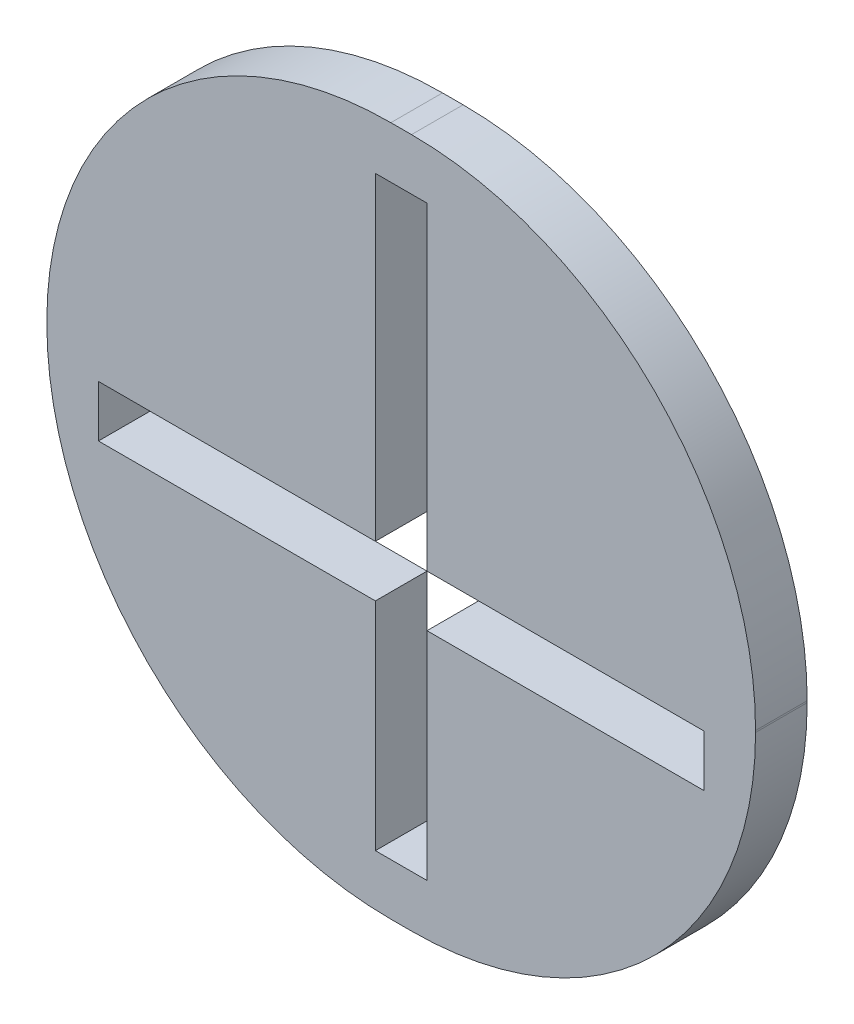
ISO-10303-21;
HEADER;
FILE_DESCRIPTION(('STEP AP214'),'2;1');
FILE_NAME('part.step','',(''),(''),'','','');
FILE_SCHEMA(('AUTOMOTIVE_DESIGN { 1 0 10303 214 1 1 1 1 }'));
ENDSEC;
DATA;
#1=APPLICATION_CONTEXT('core data for automotive mechanical design processes');
#2=APPLICATION_PROTOCOL_DEFINITION('international standard','automotive_design',2000,#1);
#3=PRODUCT_CONTEXT('',#1,'mechanical');
#4=PRODUCT('Part','Part','',(#3));
#5=PRODUCT_RELATED_PRODUCT_CATEGORY('part','',(#4));
#6=PRODUCT_DEFINITION_FORMATION('','',#4);
#7=PRODUCT_DEFINITION_CONTEXT('part definition',#1,'design');
#8=PRODUCT_DEFINITION('design','',#6,#7);
#9=PRODUCT_DEFINITION_SHAPE('','',#8);
#10=(LENGTH_UNIT() NAMED_UNIT(*) SI_UNIT(.MILLI.,.METRE.));
#11=(NAMED_UNIT(*) PLANE_ANGLE_UNIT() SI_UNIT($,.RADIAN.));
#12=(NAMED_UNIT(*) SI_UNIT($,.STERADIAN.) SOLID_ANGLE_UNIT());
#13=UNCERTAINTY_MEASURE_WITH_UNIT(LENGTH_MEASURE(1.E-05),#10,'distance_accuracy_value','');
#14=(GEOMETRIC_REPRESENTATION_CONTEXT(3) GLOBAL_UNCERTAINTY_ASSIGNED_CONTEXT((#13)) GLOBAL_UNIT_ASSIGNED_CONTEXT((#10,
#11,#12)) REPRESENTATION_CONTEXT('',''));
#15=CARTESIAN_POINT('',(0.,0.,0.));
#16=DIRECTION('',(0.,0.,1.));
#17=DIRECTION('',(1.,0.,0.));
#18=AXIS2_PLACEMENT_3D('',#15,#16,#17);
#19=CARTESIAN_POINT('',(0.,20.05,3.));
#20=DIRECTION('',(0.,-1.,0.));
#21=DIRECTION('',(0.,0.,-1.));
#22=AXIS2_PLACEMENT_3D('',#19,#20,#21);
#23=PLANE('',#22);
#24=DIRECTION('',(-1.,0.,0.));
#25=VECTOR('',#24,1.);
#26=CARTESIAN_POINT('',(0.,20.05,0.));
#27=LINE('',#26,#25);
#28=CARTESIAN_POINT('',(0.599999999999994,20.05,0.));
#29=VERTEX_POINT('',#28);
#30=CARTESIAN_POINT('',(-0.600000000000018,20.05,0.));
#31=VERTEX_POINT('',#30);
#32=EDGE_CURVE('E254',#29,#31,#27,.T.);
#33=ORIENTED_EDGE('',*,*,#32,.T.);
#34=DIRECTION('',(0.,0.,-1.));
#35=VECTOR('',#34,1.);
#36=CARTESIAN_POINT('',(-0.600000000000018,20.05,3.));
#37=LINE('',#36,#35);
#38=CARTESIAN_POINT('',(-0.600000000000018,20.05,3.));
#39=VERTEX_POINT('',#38);
#40=EDGE_CURVE('E11',#39,#31,#37,.T.);
#41=ORIENTED_EDGE('',*,*,#40,.F.);
#42=DIRECTION('',(-1.,0.,0.));
#43=VECTOR('',#42,1.);
#44=CARTESIAN_POINT('',(0.,20.05,3.));
#45=LINE('',#44,#43);
#46=CARTESIAN_POINT('',(0.599999999999994,20.05,3.));
#47=VERTEX_POINT('',#46);
#48=EDGE_CURVE('E405',#47,#39,#45,.T.);
#49=ORIENTED_EDGE('',*,*,#48,.F.);
#50=DIRECTION('',(0.,0.,-1.));
#51=VECTOR('',#50,1.);
#52=CARTESIAN_POINT('',(0.599999999999994,20.05,3.));
#53=LINE('',#52,#51);
#54=EDGE_CURVE('E281',#47,#29,#53,.T.);
#55=ORIENTED_EDGE('',*,*,#54,.T.);
#56=EDGE_LOOP('',(#33,#41,#49,#55));
#57=FACE_BOUND('',#56,.T.);
#58=ADVANCED_FACE('F45',(#57),#23,.F.);
#59=CARTESIAN_POINT('',(-0.600000000000016,0.0500000000000149,3.));
#60=DIRECTION('',(0.,0.,-1.));
#61=DIRECTION('',(-1.,0.,0.));
#62=AXIS2_PLACEMENT_3D('',#59,#60,#61);
#63=CYLINDRICAL_SURFACE('',#62,20.);
#64=CARTESIAN_POINT('',(-0.600000000000016,0.0500000000000149,0.));
#65=DIRECTION('',(0.,0.,1.));
#66=DIRECTION('',(1.,0.,0.));
#67=AXIS2_PLACEMENT_3D('',#64,#65,#66);
#68=CIRCLE('',#67,20.);
#69=CARTESIAN_POINT('',(-20.6,0.0500000000000027,0.));
#70=VERTEX_POINT('',#69);
#71=EDGE_CURVE('E258',#31,#70,#68,.T.);
#72=ORIENTED_EDGE('',*,*,#71,.T.);
#73=DIRECTION('',(0.,0.,-1.));
#74=VECTOR('',#73,1.);
#75=CARTESIAN_POINT('',(-20.6,0.0500000000000027,3.));
#76=LINE('',#75,#74);
#77=CARTESIAN_POINT('',(-20.6,0.0500000000000027,3.));
#78=VERTEX_POINT('',#77);
#79=EDGE_CURVE('E56',#78,#70,#76,.T.);
#80=ORIENTED_EDGE('',*,*,#79,.F.);
#81=CARTESIAN_POINT('',(-0.600000000000016,0.0500000000000149,3.));
#82=DIRECTION('',(0.,0.,1.));
#83=DIRECTION('',(1.,0.,0.));
#84=AXIS2_PLACEMENT_3D('',#81,#82,#83);
#85=CIRCLE('',#84,20.);
#86=EDGE_CURVE('E408',#39,#78,#85,.T.);
#87=ORIENTED_EDGE('',*,*,#86,.F.);
#88=ORIENTED_EDGE('',*,*,#40,.T.);
#89=EDGE_LOOP('',(#72,#80,#87,#88));
#90=FACE_BOUND('',#89,.T.);
#91=ADVANCED_FACE('F440',(#90),#63,.T.);
#92=CARTESIAN_POINT('',(-20.6,0.,3.));
#93=DIRECTION('',(-1.,0.,0.));
#94=DIRECTION('',(0.,0.,1.));
#95=AXIS2_PLACEMENT_3D('',#92,#93,#94);
#96=PLANE('',#95);
#97=DIRECTION('',(0.,1.,0.));
#98=VECTOR('',#97,1.);
#99=CARTESIAN_POINT('',(-20.6,0.,0.));
#100=LINE('',#99,#98);
#101=CARTESIAN_POINT('',(-20.6,-0.0500000000000111,0.));
#102=VERTEX_POINT('',#101);
#103=EDGE_CURVE('E262',#102,#70,#100,.T.);
#104=ORIENTED_EDGE('',*,*,#103,.F.);
#105=DIRECTION('',(0.,0.,-1.));
#106=VECTOR('',#105,1.);
#107=CARTESIAN_POINT('',(-20.6,-0.0500000000000111,3.));
#108=LINE('',#107,#106);
#109=CARTESIAN_POINT('',(-20.6,-0.0500000000000111,3.));
#110=VERTEX_POINT('',#109);
#111=EDGE_CURVE('E291',#110,#102,#108,.T.);
#112=ORIENTED_EDGE('',*,*,#111,.F.);
#113=DIRECTION('',(0.,1.,0.));
#114=VECTOR('',#113,1.);
#115=CARTESIAN_POINT('',(-20.6,0.,3.));
#116=LINE('',#115,#114);
#117=EDGE_CURVE('E411',#110,#78,#116,.T.);
#118=ORIENTED_EDGE('',*,*,#117,.T.);
#119=ORIENTED_EDGE('',*,*,#79,.T.);
#120=EDGE_LOOP('',(#104,#112,#118,#119));
#121=FACE_BOUND('',#120,.T.);
#122=ADVANCED_FACE('F445',(#121),#96,.T.);
#123=CARTESIAN_POINT('',(-0.600000000000015,-0.0499999999999988,3.));
#124=DIRECTION('',(0.,0.,-1.));
#125=DIRECTION('',(-1.,0.,0.));
#126=AXIS2_PLACEMENT_3D('',#123,#124,#125);
#127=CYLINDRICAL_SURFACE('',#126,20.);
#128=CARTESIAN_POINT('',(-0.600000000000015,-0.0499999999999988,0.));
#129=DIRECTION('',(0.,0.,1.));
#130=DIRECTION('',(1.,0.,0.));
#131=AXIS2_PLACEMENT_3D('',#128,#129,#130);
#132=CIRCLE('',#131,20.);
#133=CARTESIAN_POINT('',(-0.600000000000013,-20.05,0.));
#134=VERTEX_POINT('',#133);
#135=EDGE_CURVE('E266',#134,#102,#132,.F.);
#136=ORIENTED_EDGE('',*,*,#135,.F.);
#137=DIRECTION('',(0.,0.,-1.));
#138=VECTOR('',#137,1.);
#139=CARTESIAN_POINT('',(-0.600000000000013,-20.05,3.));
#140=LINE('',#139,#138);
#141=CARTESIAN_POINT('',(-0.600000000000013,-20.05,3.));
#142=VERTEX_POINT('',#141);
#143=EDGE_CURVE('E288',#142,#134,#140,.T.);
#144=ORIENTED_EDGE('',*,*,#143,.F.);
#145=CARTESIAN_POINT('',(-0.600000000000015,-0.0499999999999988,3.));
#146=DIRECTION('',(0.,0.,1.));
#147=DIRECTION('',(1.,0.,0.));
#148=AXIS2_PLACEMENT_3D('',#145,#146,#147);
#149=CIRCLE('',#148,20.);
#150=EDGE_CURVE('E415',#142,#110,#149,.F.);
#151=ORIENTED_EDGE('',*,*,#150,.T.);
#152=ORIENTED_EDGE('',*,*,#111,.T.);
#153=EDGE_LOOP('',(#136,#144,#151,#152));
#154=FACE_BOUND('',#153,.T.);
#155=ADVANCED_FACE('F608',(#154),#127,.T.);
#156=CARTESIAN_POINT('',(0.,-20.05,3.));
#157=DIRECTION('',(0.,-1.,0.));
#158=DIRECTION('',(0.,0.,-1.));
#159=AXIS2_PLACEMENT_3D('',#156,#157,#158);
#160=PLANE('',#159);
#161=DIRECTION('',(-1.,0.,0.));
#162=VECTOR('',#161,1.);
#163=CARTESIAN_POINT('',(0.,-20.05,0.));
#164=LINE('',#163,#162);
#165=CARTESIAN_POINT('',(0.600000000000013,-20.05,0.));
#166=VERTEX_POINT('',#165);
#167=EDGE_CURVE('E270',#166,#134,#164,.T.);
#168=ORIENTED_EDGE('',*,*,#167,.F.);
#169=DIRECTION('',(0.,0.,-1.));
#170=VECTOR('',#169,1.);
#171=CARTESIAN_POINT('',(0.600000000000013,-20.05,3.));
#172=LINE('',#171,#170);
#173=CARTESIAN_POINT('',(0.600000000000013,-20.05,3.));
#174=VERTEX_POINT('',#173);
#175=EDGE_CURVE('E212',#174,#166,#172,.T.);
#176=ORIENTED_EDGE('',*,*,#175,.F.);
#177=DIRECTION('',(-1.,0.,0.));
#178=VECTOR('',#177,1.);
#179=CARTESIAN_POINT('',(0.,-20.05,3.));
#180=LINE('',#179,#178);
#181=EDGE_CURVE('E203',#174,#142,#180,.T.);
#182=ORIENTED_EDGE('',*,*,#181,.T.);
#183=ORIENTED_EDGE('',*,*,#143,.T.);
#184=EDGE_LOOP('',(#168,#176,#182,#183));
#185=FACE_BOUND('',#184,.T.);
#186=ADVANCED_FACE('F421',(#185),#160,.T.);
#187=CARTESIAN_POINT('',(0.600000000000003,-0.0499999999999984,3.));
#188=DIRECTION('',(0.,0.,-1.));
#189=DIRECTION('',(-1.,0.,0.));
#190=AXIS2_PLACEMENT_3D('',#187,#188,#189);
#191=CYLINDRICAL_SURFACE('',#190,20.);
#192=CARTESIAN_POINT('',(0.600000000000003,-0.0499999999999984,0.));
#193=DIRECTION('',(0.,0.,1.));
#194=DIRECTION('',(1.,0.,0.));
#195=AXIS2_PLACEMENT_3D('',#192,#193,#194);
#196=CIRCLE('',#195,20.);
#197=CARTESIAN_POINT('',(20.6,-0.0499999999999984,0.));
#198=VERTEX_POINT('',#197);
#199=EDGE_CURVE('E210',#166,#198,#196,.T.);
#200=ORIENTED_EDGE('',*,*,#199,.T.);
#201=DIRECTION('',(0.,0.,-1.));
#202=VECTOR('',#201,1.);
#203=CARTESIAN_POINT('',(20.6,-0.0499999999999984,3.));
#204=LINE('',#203,#202);
#205=CARTESIAN_POINT('',(20.6,-0.0499999999999984,3.));
#206=VERTEX_POINT('',#205);
#207=EDGE_CURVE('E207',#206,#198,#204,.T.);
#208=ORIENTED_EDGE('',*,*,#207,.F.);
#209=CARTESIAN_POINT('',(0.600000000000003,-0.0499999999999984,3.));
#210=DIRECTION('',(0.,0.,1.));
#211=DIRECTION('',(1.,0.,0.));
#212=AXIS2_PLACEMENT_3D('',#209,#210,#211);
#213=CIRCLE('',#212,20.);
#214=EDGE_CURVE('E196',#174,#206,#213,.T.);
#215=ORIENTED_EDGE('',*,*,#214,.F.);
#216=ORIENTED_EDGE('',*,*,#175,.T.);
#217=EDGE_LOOP('',(#200,#208,#215,#216));
#218=FACE_BOUND('',#217,.T.);
#219=ADVANCED_FACE('F208',(#218),#191,.T.);
#220=CARTESIAN_POINT('',(20.6,0.,3.));
#221=DIRECTION('',(-1.,0.,0.));
#222=DIRECTION('',(0.,0.,1.));
#223=AXIS2_PLACEMENT_3D('',#220,#221,#222);
#224=PLANE('',#223);
#225=DIRECTION('',(0.,1.,0.));
#226=VECTOR('',#225,1.);
#227=CARTESIAN_POINT('',(20.6,0.,0.));
#228=LINE('',#227,#226);
#229=CARTESIAN_POINT('',(20.6,0.0500000000000153,0.));
#230=VERTEX_POINT('',#229);
#231=EDGE_CURVE('E130',#198,#230,#228,.T.);
#232=ORIENTED_EDGE('',*,*,#231,.T.);
#233=DIRECTION('',(0.,0.,-1.));
#234=VECTOR('',#233,1.);
#235=CARTESIAN_POINT('',(20.6,0.0500000000000153,3.));
#236=LINE('',#235,#234);
#237=CARTESIAN_POINT('',(20.6,0.0500000000000153,3.));
#238=VERTEX_POINT('',#237);
#239=EDGE_CURVE('E213',#238,#230,#236,.T.);
#240=ORIENTED_EDGE('',*,*,#239,.F.);
#241=DIRECTION('',(0.,1.,0.));
#242=VECTOR('',#241,1.);
#243=CARTESIAN_POINT('',(20.6,0.,3.));
#244=LINE('',#243,#242);
#245=EDGE_CURVE('E200',#206,#238,#244,.T.);
#246=ORIENTED_EDGE('',*,*,#245,.F.);
#247=ORIENTED_EDGE('',*,*,#207,.T.);
#248=EDGE_LOOP('',(#232,#240,#246,#247));
#249=FACE_BOUND('',#248,.T.);
#250=ADVANCED_FACE('F215',(#249),#224,.F.);
#251=CARTESIAN_POINT('',(0.,17.05,3.));
#252=DIRECTION('',(0.,1.,0.));
#253=DIRECTION('',(0.,0.,1.));
#254=AXIS2_PLACEMENT_3D('',#251,#252,#253);
#255=PLANE('',#254);
#256=DIRECTION('',(1.,0.,0.));
#257=VECTOR('',#256,1.);
#258=CARTESIAN_POINT('',(0.,17.05,0.));
#259=LINE('',#258,#257);
#260=CARTESIAN_POINT('',(-1.5,17.05,0.));
#261=VERTEX_POINT('',#260);
#262=CARTESIAN_POINT('',(1.5,17.05,0.));
#263=VERTEX_POINT('',#262);
#264=EDGE_CURVE('E223',#261,#263,#259,.T.);
#265=ORIENTED_EDGE('',*,*,#264,.T.);
#266=DIRECTION('',(0.,0.,-1.));
#267=VECTOR('',#266,1.);
#268=CARTESIAN_POINT('',(1.5,17.05,3.));
#269=LINE('',#268,#267);
#270=CARTESIAN_POINT('',(1.5,17.05,3.));
#271=VERTEX_POINT('',#270);
#272=EDGE_CURVE('E49',#271,#263,#269,.T.);
#273=ORIENTED_EDGE('',*,*,#272,.F.);
#274=DIRECTION('',(1.,0.,0.));
#275=VECTOR('',#274,1.);
#276=CARTESIAN_POINT('',(0.,17.05,3.));
#277=LINE('',#276,#275);
#278=CARTESIAN_POINT('',(-1.5,17.05,3.));
#279=VERTEX_POINT('',#278);
#280=EDGE_CURVE('E280',#279,#271,#277,.T.);
#281=ORIENTED_EDGE('',*,*,#280,.F.);
#282=DIRECTION('',(0.,0.,-1.));
#283=VECTOR('',#282,1.);
#284=CARTESIAN_POINT('',(-1.5,17.05,3.));
#285=LINE('',#284,#283);
#286=EDGE_CURVE('E219',#279,#261,#285,.T.);
#287=ORIENTED_EDGE('',*,*,#286,.T.);
#288=EDGE_LOOP('',(#265,#273,#281,#287));
#289=FACE_BOUND('',#288,.T.);
#290=ADVANCED_FACE('F47',(#289),#255,.F.);
#291=CARTESIAN_POINT('',(1.5,0.,3.));
#292=DIRECTION('',(1.,0.,0.));
#293=DIRECTION('',(0.,0.,-1.));
#294=AXIS2_PLACEMENT_3D('',#291,#292,#293);
#295=PLANE('',#294);
#296=DIRECTION('',(0.,-1.,0.));
#297=VECTOR('',#296,1.);
#298=CARTESIAN_POINT('',(1.5,0.,0.));
#299=LINE('',#298,#297);
#300=CARTESIAN_POINT('',(1.5,-1.475,0.));
#301=VERTEX_POINT('',#300);
#302=EDGE_CURVE('E227',#263,#301,#299,.T.);
#303=ORIENTED_EDGE('',*,*,#302,.T.);
#304=DIRECTION('',(0.,0.,-1.));
#305=VECTOR('',#304,1.);
#306=CARTESIAN_POINT('',(1.5,-1.475,3.));
#307=LINE('',#306,#305);
#308=CARTESIAN_POINT('',(1.5,-1.475,3.));
#309=VERTEX_POINT('',#308);
#310=EDGE_CURVE('E329',#309,#301,#307,.T.);
#311=ORIENTED_EDGE('',*,*,#310,.F.);
#312=DIRECTION('',(0.,-1.,0.));
#313=VECTOR('',#312,1.);
#314=CARTESIAN_POINT('',(1.5,0.,3.));
#315=LINE('',#314,#313);
#316=EDGE_CURVE('E145',#271,#309,#315,.T.);
#317=ORIENTED_EDGE('',*,*,#316,.F.);
#318=ORIENTED_EDGE('',*,*,#272,.T.);
#319=EDGE_LOOP('',(#303,#311,#317,#318));
#320=FACE_BOUND('',#319,.T.);
#321=ADVANCED_FACE('F337',(#320),#295,.F.);
#322=CARTESIAN_POINT('',(0.,-1.475,3.));
#323=DIRECTION('',(0.,1.,0.));
#324=DIRECTION('',(0.,0.,1.));
#325=AXIS2_PLACEMENT_3D('',#322,#323,#324);
#326=PLANE('',#325);
#327=DIRECTION('',(1.,0.,0.));
#328=VECTOR('',#327,1.);
#329=CARTESIAN_POINT('',(0.,-1.475,0.));
#330=LINE('',#329,#328);
#331=CARTESIAN_POINT('',(17.6,-1.475,0.));
#332=VERTEX_POINT('',#331);
#333=EDGE_CURVE('E230',#301,#332,#330,.T.);
#334=ORIENTED_EDGE('',*,*,#333,.T.);
#335=DIRECTION('',(0.,0.,-1.));
#336=VECTOR('',#335,1.);
#337=CARTESIAN_POINT('',(17.6,-1.475,3.));
#338=LINE('',#337,#336);
#339=CARTESIAN_POINT('',(17.6,-1.475,3.));
#340=VERTEX_POINT('',#339);
#341=EDGE_CURVE('E326',#340,#332,#338,.T.);
#342=ORIENTED_EDGE('',*,*,#341,.F.);
#343=DIRECTION('',(1.,0.,0.));
#344=VECTOR('',#343,1.);
#345=CARTESIAN_POINT('',(0.,-1.475,3.));
#346=LINE('',#345,#344);
#347=EDGE_CURVE('E477',#309,#340,#346,.T.);
#348=ORIENTED_EDGE('',*,*,#347,.F.);
#349=ORIENTED_EDGE('',*,*,#310,.T.);
#350=EDGE_LOOP('',(#334,#342,#348,#349));
#351=FACE_BOUND('',#350,.T.);
#352=ADVANCED_FACE('F452',(#351),#326,.F.);
#353=CARTESIAN_POINT('',(17.6,0.,3.));
#354=DIRECTION('',(1.,0.,0.));
#355=DIRECTION('',(0.,1.,0.));
#356=AXIS2_PLACEMENT_3D('',#353,#354,#355);
#357=PLANE('',#356);
#358=DIRECTION('',(0.,-1.,0.));
#359=VECTOR('',#358,1.);
#360=CARTESIAN_POINT('',(17.6,0.,0.));
#361=LINE('',#360,#359);
#362=CARTESIAN_POINT('',(17.6,-4.47500000000001,0.));
#363=VERTEX_POINT('',#362);
#364=EDGE_CURVE('E234',#332,#363,#361,.T.);
#365=ORIENTED_EDGE('',*,*,#364,.T.);
#366=DIRECTION('',(0.,0.,-1.));
#367=VECTOR('',#366,1.);
#368=CARTESIAN_POINT('',(17.6,-4.47500000000001,3.));
#369=LINE('',#368,#367);
#370=CARTESIAN_POINT('',(17.6,-4.47500000000001,3.));
#371=VERTEX_POINT('',#370);
#372=EDGE_CURVE('E322',#371,#363,#369,.T.);
#373=ORIENTED_EDGE('',*,*,#372,.F.);
#374=DIRECTION('',(0.,-1.,0.));
#375=VECTOR('',#374,1.);
#376=CARTESIAN_POINT('',(17.6,0.,3.));
#377=LINE('',#376,#375);
#378=EDGE_CURVE('E475',#340,#371,#377,.T.);
#379=ORIENTED_EDGE('',*,*,#378,.F.);
#380=ORIENTED_EDGE('',*,*,#341,.T.);
#381=EDGE_LOOP('',(#365,#373,#379,#380));
#382=FACE_BOUND('',#381,.T.);
#383=ADVANCED_FACE('F461',(#382),#357,.F.);
#384=CARTESIAN_POINT('',(0.,-4.47500000000001,3.));
#385=DIRECTION('',(0.,-1.,0.));
#386=DIRECTION('',(0.,0.,-1.));
#387=AXIS2_PLACEMENT_3D('',#384,#385,#386);
#388=PLANE('',#387);
#389=DIRECTION('',(-1.,0.,0.));
#390=VECTOR('',#389,1.);
#391=CARTESIAN_POINT('',(0.,-4.47500000000001,0.));
#392=LINE('',#391,#390);
#393=CARTESIAN_POINT('',(1.5,-4.47500000000001,0.));
#394=VERTEX_POINT('',#393);
#395=EDGE_CURVE('E238',#363,#394,#392,.T.);
#396=ORIENTED_EDGE('',*,*,#395,.T.);
#397=DIRECTION('',(0.,0.,-1.));
#398=VECTOR('',#397,1.);
#399=CARTESIAN_POINT('',(1.5,-4.47500000000001,3.));
#400=LINE('',#399,#398);
#401=CARTESIAN_POINT('',(1.5,-4.47500000000001,3.));
#402=VERTEX_POINT('',#401);
#403=EDGE_CURVE('E318',#402,#394,#400,.T.);
#404=ORIENTED_EDGE('',*,*,#403,.F.);
#405=DIRECTION('',(-1.,0.,0.));
#406=VECTOR('',#405,1.);
#407=CARTESIAN_POINT('',(0.,-4.47500000000001,3.));
#408=LINE('',#407,#406);
#409=EDGE_CURVE('E397',#371,#402,#408,.T.);
#410=ORIENTED_EDGE('',*,*,#409,.F.);
#411=ORIENTED_EDGE('',*,*,#372,.T.);
#412=EDGE_LOOP('',(#396,#404,#410,#411));
#413=FACE_BOUND('',#412,.T.);
#414=ADVANCED_FACE('F457',(#413),#388,.F.);
#415=CARTESIAN_POINT('',(1.5,-17.05,0.));
#416=VERTEX_POINT('',#415);
#417=EDGE_CURVE('E231',#394,#416,#299,.T.);
#418=ORIENTED_EDGE('',*,*,#417,.T.);
#419=DIRECTION('',(0.,0.,-1.));
#420=VECTOR('',#419,1.);
#421=CARTESIAN_POINT('',(1.5,-17.05,3.));
#422=LINE('',#421,#420);
#423=CARTESIAN_POINT('',(1.5,-17.05,3.));
#424=VERTEX_POINT('',#423);
#425=EDGE_CURVE('E315',#424,#416,#422,.T.);
#426=ORIENTED_EDGE('',*,*,#425,.F.);
#427=EDGE_CURVE('E391',#402,#424,#315,.T.);
#428=ORIENTED_EDGE('',*,*,#427,.F.);
#429=ORIENTED_EDGE('',*,*,#403,.T.);
#430=EDGE_LOOP('',(#418,#426,#428,#429));
#431=FACE_BOUND('',#430,.T.);
#432=ADVANCED_FACE('F377',(#431),#295,.F.);
#433=CARTESIAN_POINT('',(0.,-17.05,3.));
#434=DIRECTION('',(0.,1.,0.));
#435=DIRECTION('',(0.,0.,1.));
#436=AXIS2_PLACEMENT_3D('',#433,#434,#435);
#437=PLANE('',#436);
#438=DIRECTION('',(1.,0.,0.));
#439=VECTOR('',#438,1.);
#440=CARTESIAN_POINT('',(0.,-17.05,0.));
#441=LINE('',#440,#439);
#442=CARTESIAN_POINT('',(-1.5,-17.05,0.));
#443=VERTEX_POINT('',#442);
#444=EDGE_CURVE('E242',#443,#416,#441,.T.);
#445=ORIENTED_EDGE('',*,*,#444,.F.);
#446=DIRECTION('',(0.,0.,-1.));
#447=VECTOR('',#446,1.);
#448=CARTESIAN_POINT('',(-1.5,-17.05,3.));
#449=LINE('',#448,#447);
#450=CARTESIAN_POINT('',(-1.5,-17.05,3.));
#451=VERTEX_POINT('',#450);
#452=EDGE_CURVE('E312',#451,#443,#449,.T.);
#453=ORIENTED_EDGE('',*,*,#452,.F.);
#454=DIRECTION('',(1.,0.,0.));
#455=VECTOR('',#454,1.);
#456=CARTESIAN_POINT('',(0.,-17.05,3.));
#457=LINE('',#456,#455);
#458=EDGE_CURVE('E386',#451,#424,#457,.T.);
#459=ORIENTED_EDGE('',*,*,#458,.T.);
#460=ORIENTED_EDGE('',*,*,#425,.T.);
#461=EDGE_LOOP('',(#445,#453,#459,#460));
#462=FACE_BOUND('',#461,.T.);
#463=ADVANCED_FACE('F384',(#462),#437,.T.);
#464=CARTESIAN_POINT('',(-1.5,0.,3.));
#465=DIRECTION('',(1.,0.,0.));
#466=DIRECTION('',(0.,0.,-1.));
#467=AXIS2_PLACEMENT_3D('',#464,#465,#466);
#468=PLANE('',#467);
#469=DIRECTION('',(0.,-1.,0.));
#470=VECTOR('',#469,1.);
#471=CARTESIAN_POINT('',(-1.5,0.,0.));
#472=LINE('',#471,#470);
#473=CARTESIAN_POINT('',(-1.5,-4.47500000000001,0.));
#474=VERTEX_POINT('',#473);
#475=EDGE_CURVE('E246',#474,#443,#472,.T.);
#476=ORIENTED_EDGE('',*,*,#475,.F.);
#477=DIRECTION('',(0.,0.,-1.));
#478=VECTOR('',#477,1.);
#479=CARTESIAN_POINT('',(-1.5,-4.47500000000001,3.));
#480=LINE('',#479,#478);
#481=CARTESIAN_POINT('',(-1.5,-4.47500000000001,3.));
#482=VERTEX_POINT('',#481);
#483=EDGE_CURVE('E309',#482,#474,#480,.T.);
#484=ORIENTED_EDGE('',*,*,#483,.F.);
#485=DIRECTION('',(0.,-1.,0.));
#486=VECTOR('',#485,1.);
#487=CARTESIAN_POINT('',(-1.5,0.,3.));
#488=LINE('',#487,#486);
#489=EDGE_CURVE('E390',#482,#451,#488,.T.);
#490=ORIENTED_EDGE('',*,*,#489,.T.);
#491=ORIENTED_EDGE('',*,*,#452,.T.);
#492=EDGE_LOOP('',(#476,#484,#490,#491));
#493=FACE_BOUND('',#492,.T.);
#494=ADVANCED_FACE('F436',(#493),#468,.T.);
#495=CARTESIAN_POINT('',(-17.6,-4.47500000000001,0.));
#496=VERTEX_POINT('',#495);
#497=EDGE_CURVE('E241',#474,#496,#392,.T.);
#498=ORIENTED_EDGE('',*,*,#497,.T.);
#499=DIRECTION('',(0.,0.,-1.));
#500=VECTOR('',#499,1.);
#501=CARTESIAN_POINT('',(-17.6,-4.47500000000001,3.));
#502=LINE('',#501,#500);
#503=CARTESIAN_POINT('',(-17.6,-4.47500000000001,3.));
#504=VERTEX_POINT('',#503);
#505=EDGE_CURVE('E305',#504,#496,#502,.T.);
#506=ORIENTED_EDGE('',*,*,#505,.F.);
#507=EDGE_CURVE('E369',#482,#504,#408,.T.);
#508=ORIENTED_EDGE('',*,*,#507,.F.);
#509=ORIENTED_EDGE('',*,*,#483,.T.);
#510=EDGE_LOOP('',(#498,#506,#508,#509));
#511=FACE_BOUND('',#510,.T.);
#512=ADVANCED_FACE('F368',(#511),#388,.F.);
#513=CARTESIAN_POINT('',(-17.6,0.,3.));
#514=DIRECTION('',(-1.,0.,0.));
#515=DIRECTION('',(0.,-1.,0.));
#516=AXIS2_PLACEMENT_3D('',#513,#514,#515);
#517=PLANE('',#516);
#518=DIRECTION('',(0.,1.,0.));
#519=VECTOR('',#518,1.);
#520=CARTESIAN_POINT('',(-17.6,0.,0.));
#521=LINE('',#520,#519);
#522=CARTESIAN_POINT('',(-17.6,-1.475,0.));
#523=VERTEX_POINT('',#522);
#524=EDGE_CURVE('E251',#496,#523,#521,.T.);
#525=ORIENTED_EDGE('',*,*,#524,.T.);
#526=DIRECTION('',(0.,0.,-1.));
#527=VECTOR('',#526,1.);
#528=CARTESIAN_POINT('',(-17.6,-1.475,3.));
#529=LINE('',#528,#527);
#530=CARTESIAN_POINT('',(-17.6,-1.475,3.));
#531=VERTEX_POINT('',#530);
#532=EDGE_CURVE('E301',#531,#523,#529,.T.);
#533=ORIENTED_EDGE('',*,*,#532,.F.);
#534=DIRECTION('',(0.,1.,0.));
#535=VECTOR('',#534,1.);
#536=CARTESIAN_POINT('',(-17.6,0.,3.));
#537=LINE('',#536,#535);
#538=EDGE_CURVE('E365',#504,#531,#537,.T.);
#539=ORIENTED_EDGE('',*,*,#538,.F.);
#540=ORIENTED_EDGE('',*,*,#505,.T.);
#541=EDGE_LOOP('',(#525,#533,#539,#540));
#542=FACE_BOUND('',#541,.T.);
#543=ADVANCED_FACE('F362',(#542),#517,.F.);
#544=CARTESIAN_POINT('',(-1.5,-1.475,0.));
#545=VERTEX_POINT('',#544);
#546=EDGE_CURVE('E235',#523,#545,#330,.T.);
#547=ORIENTED_EDGE('',*,*,#546,.T.);
#548=DIRECTION('',(0.,0.,-1.));
#549=VECTOR('',#548,1.);
#550=CARTESIAN_POINT('',(-1.5,-1.475,3.));
#551=LINE('',#550,#549);
#552=CARTESIAN_POINT('',(-1.5,-1.475,3.));
#553=VERTEX_POINT('',#552);
#554=EDGE_CURVE('E298',#553,#545,#551,.T.);
#555=ORIENTED_EDGE('',*,*,#554,.F.);
#556=EDGE_CURVE('E404',#531,#553,#346,.T.);
#557=ORIENTED_EDGE('',*,*,#556,.F.);
#558=ORIENTED_EDGE('',*,*,#532,.T.);
#559=EDGE_LOOP('',(#547,#555,#557,#558));
#560=FACE_BOUND('',#559,.T.);
#561=ADVANCED_FACE('F355',(#560),#326,.F.);
#562=EDGE_CURVE('E250',#261,#545,#472,.T.);
#563=ORIENTED_EDGE('',*,*,#562,.F.);
#564=ORIENTED_EDGE('',*,*,#286,.F.);
#565=EDGE_CURVE('E396',#279,#553,#488,.T.);
#566=ORIENTED_EDGE('',*,*,#565,.T.);
#567=ORIENTED_EDGE('',*,*,#554,.T.);
#568=EDGE_LOOP('',(#563,#564,#566,#567));
#569=FACE_BOUND('',#568,.T.);
#570=ADVANCED_FACE('F348',(#569),#468,.T.);
#571=CARTESIAN_POINT('',(0.600000000000003,0.0500000000000153,3.));
#572=DIRECTION('',(0.,0.,-1.));
#573=DIRECTION('',(-1.,0.,0.));
#574=AXIS2_PLACEMENT_3D('',#571,#572,#573);
#575=CYLINDRICAL_SURFACE('',#574,20.);
#576=CARTESIAN_POINT('',(0.600000000000003,0.0500000000000153,0.));
#577=DIRECTION('',(0.,0.,1.));
#578=DIRECTION('',(1.,0.,0.));
#579=AXIS2_PLACEMENT_3D('',#576,#577,#578);
#580=CIRCLE('',#579,20.);
#581=EDGE_CURVE('E136',#230,#29,#580,.T.);
#582=ORIENTED_EDGE('',*,*,#581,.T.);
#583=ORIENTED_EDGE('',*,*,#54,.F.);
#584=CARTESIAN_POINT('',(0.600000000000003,0.0500000000000153,3.));
#585=DIRECTION('',(0.,0.,1.));
#586=DIRECTION('',(1.,0.,0.));
#587=AXIS2_PLACEMENT_3D('',#584,#585,#586);
#588=CIRCLE('',#587,20.);
#589=EDGE_CURVE('E65',#238,#47,#588,.T.);
#590=ORIENTED_EDGE('',*,*,#589,.F.);
#591=ORIENTED_EDGE('',*,*,#239,.T.);
#592=EDGE_LOOP('',(#582,#583,#590,#591));
#593=FACE_BOUND('',#592,.T.);
#594=ADVANCED_FACE('F427',(#593),#575,.T.);
#595=CARTESIAN_POINT('',(0.,0.,3.));
#596=DIRECTION('',(0.,0.,1.));
#597=DIRECTION('',(1.,0.,0.));
#598=AXIS2_PLACEMENT_3D('',#595,#596,#597);
#599=PLANE('',#598);
#600=ORIENTED_EDGE('',*,*,#280,.T.);
#601=ORIENTED_EDGE('',*,*,#316,.T.);
#602=ORIENTED_EDGE('',*,*,#347,.T.);
#603=ORIENTED_EDGE('',*,*,#378,.T.);
#604=ORIENTED_EDGE('',*,*,#409,.T.);
#605=ORIENTED_EDGE('',*,*,#427,.T.);
#606=ORIENTED_EDGE('',*,*,#458,.F.);
#607=ORIENTED_EDGE('',*,*,#489,.F.);
#608=ORIENTED_EDGE('',*,*,#507,.T.);
#609=ORIENTED_EDGE('',*,*,#538,.T.);
#610=ORIENTED_EDGE('',*,*,#556,.T.);
#611=ORIENTED_EDGE('',*,*,#565,.F.);
#612=EDGE_LOOP('',(#600,#601,#602,#603,#604,#605,#606,#607,#608,#609,#610,#611));
#613=FACE_BOUND('',#612,.T.);
#614=ORIENTED_EDGE('',*,*,#48,.T.);
#615=ORIENTED_EDGE('',*,*,#86,.T.);
#616=ORIENTED_EDGE('',*,*,#117,.F.);
#617=ORIENTED_EDGE('',*,*,#150,.F.);
#618=ORIENTED_EDGE('',*,*,#181,.F.);
#619=ORIENTED_EDGE('',*,*,#214,.T.);
#620=ORIENTED_EDGE('',*,*,#245,.T.);
#621=ORIENTED_EDGE('',*,*,#589,.T.);
#622=EDGE_LOOP('',(#614,#615,#616,#617,#618,#619,#620,#621));
#623=FACE_BOUND('',#622,.T.);
#624=ADVANCED_FACE('F198',(#613,#623),#599,.T.);
#625=CARTESIAN_POINT('',(0.,0.,0.));
#626=DIRECTION('',(0.,0.,1.));
#627=DIRECTION('',(1.,0.,0.));
#628=AXIS2_PLACEMENT_3D('',#625,#626,#627);
#629=PLANE('',#628);
#630=ORIENTED_EDGE('',*,*,#264,.F.);
#631=ORIENTED_EDGE('',*,*,#562,.T.);
#632=ORIENTED_EDGE('',*,*,#546,.F.);
#633=ORIENTED_EDGE('',*,*,#524,.F.);
#634=ORIENTED_EDGE('',*,*,#497,.F.);
#635=ORIENTED_EDGE('',*,*,#475,.T.);
#636=ORIENTED_EDGE('',*,*,#444,.T.);
#637=ORIENTED_EDGE('',*,*,#417,.F.);
#638=ORIENTED_EDGE('',*,*,#395,.F.);
#639=ORIENTED_EDGE('',*,*,#364,.F.);
#640=ORIENTED_EDGE('',*,*,#333,.F.);
#641=ORIENTED_EDGE('',*,*,#302,.F.);
#642=EDGE_LOOP('',(#630,#631,#632,#633,#634,#635,#636,#637,#638,#639,#640,#641));
#643=FACE_BOUND('',#642,.T.);
#644=ORIENTED_EDGE('',*,*,#32,.F.);
#645=ORIENTED_EDGE('',*,*,#581,.F.);
#646=ORIENTED_EDGE('',*,*,#231,.F.);
#647=ORIENTED_EDGE('',*,*,#199,.F.);
#648=ORIENTED_EDGE('',*,*,#167,.T.);
#649=ORIENTED_EDGE('',*,*,#135,.T.);
#650=ORIENTED_EDGE('',*,*,#103,.T.);
#651=ORIENTED_EDGE('',*,*,#71,.F.);
#652=EDGE_LOOP('',(#644,#645,#646,#647,#648,#649,#650,#651));
#653=FACE_BOUND('',#652,.T.);
#654=ADVANCED_FACE('F344',(#643,#653),#629,.F.);
#655=CLOSED_SHELL('',(#58,#91,#122,#155,#186,#219,#250,#290,#321,#352,#383,#414,#432,#463,#494,
#512,#543,#561,#570,#594,#624,#654));
#656=MANIFOLD_SOLID_BREP('B2',#655);
#657=ADVANCED_BREP_SHAPE_REPRESENTATION('',(#18,#656),#14);
#658=SHAPE_DEFINITION_REPRESENTATION(#9,#657);
ENDSEC;
END-ISO-10303-21;
